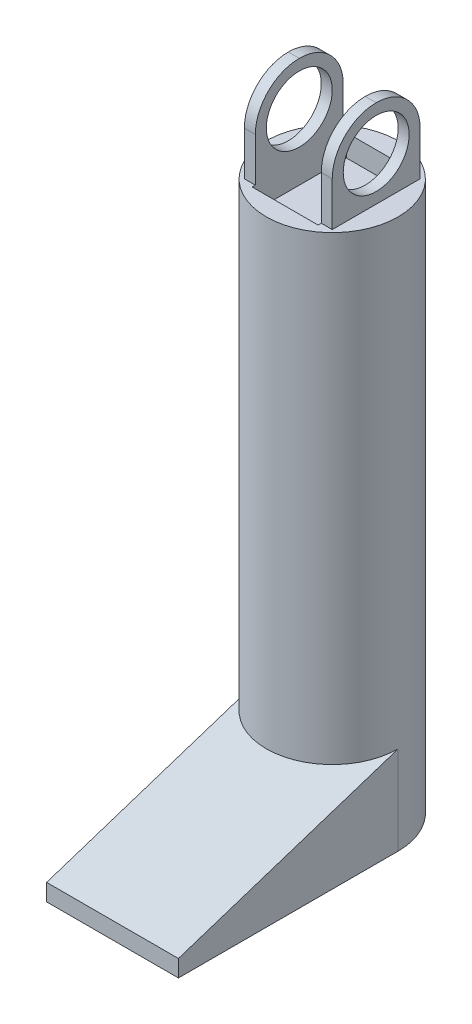
ISO-10303-21;
HEADER;
FILE_DESCRIPTION(('STEP AP214'),'2;1');
FILE_NAME('part.step','',(''),(''),'','','');
FILE_SCHEMA(('AUTOMOTIVE_DESIGN { 1 0 10303 214 1 1 1 1 }'));
ENDSEC;
DATA;
#1=APPLICATION_CONTEXT('core data for automotive mechanical design processes');
#2=APPLICATION_PROTOCOL_DEFINITION('international standard','automotive_design',2000,#1);
#3=PRODUCT_CONTEXT('',#1,'mechanical');
#4=PRODUCT('Part','Part','',(#3));
#5=PRODUCT_RELATED_PRODUCT_CATEGORY('part','',(#4));
#6=PRODUCT_DEFINITION_FORMATION('','',#4);
#7=PRODUCT_DEFINITION_CONTEXT('part definition',#1,'design');
#8=PRODUCT_DEFINITION('design','',#6,#7);
#9=PRODUCT_DEFINITION_SHAPE('','',#8);
#10=(LENGTH_UNIT() NAMED_UNIT(*) SI_UNIT(.MILLI.,.METRE.));
#11=(NAMED_UNIT(*) PLANE_ANGLE_UNIT() SI_UNIT($,.RADIAN.));
#12=(NAMED_UNIT(*) SI_UNIT($,.STERADIAN.) SOLID_ANGLE_UNIT());
#13=UNCERTAINTY_MEASURE_WITH_UNIT(LENGTH_MEASURE(1.E-05),#10,'distance_accuracy_value','');
#14=(GEOMETRIC_REPRESENTATION_CONTEXT(3) GLOBAL_UNCERTAINTY_ASSIGNED_CONTEXT((#13)) GLOBAL_UNIT_ASSIGNED_CONTEXT((#10,
#11,#12)) REPRESENTATION_CONTEXT('',''));
#15=CARTESIAN_POINT('',(0.,0.,0.));
#16=DIRECTION('',(0.,0.,1.));
#17=DIRECTION('',(1.,0.,0.));
#18=AXIS2_PLACEMENT_3D('',#15,#16,#17);
#19=CARTESIAN_POINT('',(-3.,4.03289864058456,10.));
#20=DIRECTION('',(1.,0.,0.));
#21=DIRECTION('',(0.,0.,-1.));
#22=AXIS2_PLACEMENT_3D('',#19,#20,#21);
#23=PLANE('',#22);
#24=DIRECTION('',(0.,0.310266308273967,-0.950649682033315));
#25=VECTOR('',#24,1.);
#26=CARTESIAN_POINT('',(-3.,3.64467091875967,1.18952187352377));
#27=LINE('',#26,#25);
#28=CARTESIAN_POINT('',(-3.,0.76916948632505,10.));
#29=VERTEX_POINT('',#28);
#30=CARTESIAN_POINT('',(-3.,4.03289864058456,0.));
#31=VERTEX_POINT('',#30);
#32=EDGE_CURVE('E51',#29,#31,#27,.T.);
#33=ORIENTED_EDGE('',*,*,#32,.T.);
#34=DIRECTION('',(0.,-1.,0.));
#35=VECTOR('',#34,1.);
#36=CARTESIAN_POINT('',(-3.,4.03289864058456,0.));
#37=LINE('',#36,#35);
#38=CARTESIAN_POINT('',(-3.,0.,0.));
#39=VERTEX_POINT('',#38);
#40=EDGE_CURVE('E177',#31,#39,#37,.T.);
#41=ORIENTED_EDGE('',*,*,#40,.T.);
#42=DIRECTION('',(0.,0.,-1.));
#43=VECTOR('',#42,1.);
#44=CARTESIAN_POINT('',(-3.,0.,10.));
#45=LINE('',#44,#43);
#46=CARTESIAN_POINT('',(-3.,0.,10.));
#47=VERTEX_POINT('',#46);
#48=EDGE_CURVE('E194',#47,#39,#45,.T.);
#49=ORIENTED_EDGE('',*,*,#48,.F.);
#50=DIRECTION('',(0.,-1.,0.));
#51=VECTOR('',#50,1.);
#52=CARTESIAN_POINT('',(-3.,4.03289864058456,10.));
#53=LINE('',#52,#51);
#54=EDGE_CURVE('E179',#29,#47,#53,.T.);
#55=ORIENTED_EDGE('',*,*,#54,.F.);
#56=EDGE_LOOP('',(#33,#41,#49,#55));
#57=FACE_BOUND('',#56,.T.);
#58=ADVANCED_FACE('F37',(#57),#23,.F.);
#59=CARTESIAN_POINT('',(3.,4.03289864058456,10.));
#60=DIRECTION('',(-1.,0.,0.));
#61=DIRECTION('',(0.,0.,1.));
#62=AXIS2_PLACEMENT_3D('',#59,#60,#61);
#63=PLANE('',#62);
#64=DIRECTION('',(0.,0.310266308273967,-0.950649682033316));
#65=VECTOR('',#64,1.);
#66=CARTESIAN_POINT('',(3.,1.08335296752159,9.03734817950044));
#67=LINE('',#66,#65);
#68=CARTESIAN_POINT('',(3.,0.76916948632505,10.));
#69=VERTEX_POINT('',#68);
#70=CARTESIAN_POINT('',(3.,4.03289864058456,0.));
#71=VERTEX_POINT('',#70);
#72=EDGE_CURVE('E171',#69,#71,#67,.T.);
#73=ORIENTED_EDGE('',*,*,#72,.F.);
#74=DIRECTION('',(0.,1.,0.));
#75=VECTOR('',#74,1.);
#76=CARTESIAN_POINT('',(3.,4.03289864058456,10.));
#77=LINE('',#76,#75);
#78=CARTESIAN_POINT('',(3.,0.,10.));
#79=VERTEX_POINT('',#78);
#80=EDGE_CURVE('E189',#79,#69,#77,.T.);
#81=ORIENTED_EDGE('',*,*,#80,.F.);
#82=DIRECTION('',(0.,0.,-1.));
#83=VECTOR('',#82,1.);
#84=CARTESIAN_POINT('',(3.,0.,10.));
#85=LINE('',#84,#83);
#86=CARTESIAN_POINT('',(3.,0.,0.));
#87=VERTEX_POINT('',#86);
#88=EDGE_CURVE('E192',#79,#87,#85,.T.);
#89=ORIENTED_EDGE('',*,*,#88,.T.);
#90=DIRECTION('',(0.,1.,0.));
#91=VECTOR('',#90,1.);
#92=CARTESIAN_POINT('',(3.,4.03289864058456,0.));
#93=LINE('',#92,#91);
#94=EDGE_CURVE('E184',#87,#71,#93,.T.);
#95=ORIENTED_EDGE('',*,*,#94,.T.);
#96=EDGE_LOOP('',(#73,#81,#89,#95));
#97=FACE_BOUND('',#96,.T.);
#98=ADVANCED_FACE('F364',(#97),#63,.F.);
#99=CARTESIAN_POINT('',(0.,0.,10.));
#100=DIRECTION('',(0.,0.,-1.));
#101=DIRECTION('',(-1.,0.,0.));
#102=AXIS2_PLACEMENT_3D('',#99,#100,#101);
#103=PLANE('',#102);
#104=DIRECTION('',(1.,0.,0.));
#105=VECTOR('',#104,1.);
#106=CARTESIAN_POINT('',(0.,0.769169486325047,10.));
#107=LINE('',#106,#105);
#108=EDGE_CURVE('E11',#29,#69,#107,.T.);
#109=ORIENTED_EDGE('',*,*,#108,.F.);
#110=ORIENTED_EDGE('',*,*,#54,.T.);
#111=DIRECTION('',(1.,0.,0.));
#112=VECTOR('',#111,1.);
#113=CARTESIAN_POINT('',(3.,0.,10.));
#114=LINE('',#113,#112);
#115=EDGE_CURVE('E634',#47,#79,#114,.T.);
#116=ORIENTED_EDGE('',*,*,#115,.T.);
#117=ORIENTED_EDGE('',*,*,#80,.T.);
#118=EDGE_LOOP('',(#109,#110,#116,#117));
#119=FACE_BOUND('',#118,.T.);
#120=ADVANCED_FACE('F355',(#119),#103,.F.);
#121=CARTESIAN_POINT('',(2.,29.,2.));
#122=DIRECTION('',(0.,0.,-1.));
#123=DIRECTION('',(-1.,0.,0.));
#124=AXIS2_PLACEMENT_3D('',#121,#122,#123);
#125=PLANE('',#124);
#126=DIRECTION('',(0.,1.,0.));
#127=VECTOR('',#126,1.);
#128=CARTESIAN_POINT('',(-1.5,29.,2.));
#129=LINE('',#128,#127);
#130=CARTESIAN_POINT('',(-1.5,25.,2.));
#131=VERTEX_POINT('',#130);
#132=CARTESIAN_POINT('',(-1.5,27.,2.));
#133=VERTEX_POINT('',#132);
#134=EDGE_CURVE('E245',#131,#133,#129,.T.);
#135=ORIENTED_EDGE('',*,*,#134,.T.);
#136=DIRECTION('',(1.,0.,0.));
#137=VECTOR('',#136,1.);
#138=CARTESIAN_POINT('',(2.,27.,2.));
#139=LINE('',#138,#137);
#140=CARTESIAN_POINT('',(-2.,27.,2.));
#141=VERTEX_POINT('',#140);
#142=EDGE_CURVE('E168',#133,#141,#139,.F.);
#143=ORIENTED_EDGE('',*,*,#142,.T.);
#144=DIRECTION('',(0.,-1.,0.));
#145=VECTOR('',#144,1.);
#146=CARTESIAN_POINT('',(-2.,29.,2.));
#147=LINE('',#146,#145);
#148=CARTESIAN_POINT('',(-2.,25.,2.));
#149=VERTEX_POINT('',#148);
#150=EDGE_CURVE('E268',#141,#149,#147,.T.);
#151=ORIENTED_EDGE('',*,*,#150,.T.);
#152=DIRECTION('',(1.,0.,0.));
#153=VECTOR('',#152,1.);
#154=CARTESIAN_POINT('',(2.,25.,2.));
#155=LINE('',#154,#153);
#156=EDGE_CURVE('E252',#149,#131,#155,.T.);
#157=ORIENTED_EDGE('',*,*,#156,.T.);
#158=EDGE_LOOP('',(#135,#143,#151,#157));
#159=FACE_BOUND('',#158,.T.);
#160=ADVANCED_FACE('F317',(#159),#125,.F.);
#161=CARTESIAN_POINT('',(2.,29.,-2.));
#162=DIRECTION('',(0.,0.,1.));
#163=DIRECTION('',(1.,0.,0.));
#164=AXIS2_PLACEMENT_3D('',#161,#162,#163);
#165=PLANE('',#164);
#166=DIRECTION('',(0.,-1.,0.));
#167=VECTOR('',#166,1.);
#168=CARTESIAN_POINT('',(-2.,29.,-2.));
#169=LINE('',#168,#167);
#170=CARTESIAN_POINT('',(-2.,27.,-2.));
#171=VERTEX_POINT('',#170);
#172=CARTESIAN_POINT('',(-2.,25.,-2.));
#173=VERTEX_POINT('',#172);
#174=EDGE_CURVE('E262',#171,#173,#169,.T.);
#175=ORIENTED_EDGE('',*,*,#174,.F.);
#176=DIRECTION('',(-1.,0.,0.));
#177=VECTOR('',#176,1.);
#178=CARTESIAN_POINT('',(2.,27.,-2.));
#179=LINE('',#178,#177);
#180=CARTESIAN_POINT('',(-1.5,27.,-2.));
#181=VERTEX_POINT('',#180);
#182=EDGE_CURVE('E297',#171,#181,#179,.F.);
#183=ORIENTED_EDGE('',*,*,#182,.T.);
#184=DIRECTION('',(0.,-1.,0.));
#185=VECTOR('',#184,1.);
#186=CARTESIAN_POINT('',(-1.5,29.,-2.));
#187=LINE('',#186,#185);
#188=CARTESIAN_POINT('',(-1.5,25.,-2.));
#189=VERTEX_POINT('',#188);
#190=EDGE_CURVE('E240',#181,#189,#187,.T.);
#191=ORIENTED_EDGE('',*,*,#190,.T.);
#192=DIRECTION('',(-1.,0.,0.));
#193=VECTOR('',#192,1.);
#194=CARTESIAN_POINT('',(2.,25.,-2.));
#195=LINE('',#194,#193);
#196=EDGE_CURVE('E258',#189,#173,#195,.T.);
#197=ORIENTED_EDGE('',*,*,#196,.T.);
#198=EDGE_LOOP('',(#175,#183,#191,#197));
#199=FACE_BOUND('',#198,.T.);
#200=ADVANCED_FACE('F346',(#199),#165,.F.);
#201=CARTESIAN_POINT('',(0.,25.,0.));
#202=DIRECTION('',(0.,1.,0.));
#203=DIRECTION('',(0.,0.,1.));
#204=AXIS2_PLACEMENT_3D('',#201,#202,#203);
#205=PLANE('',#204);
#206=DIRECTION('',(0.,0.,1.));
#207=VECTOR('',#206,1.);
#208=CARTESIAN_POINT('',(-1.5,25.,0.));
#209=LINE('',#208,#207);
#210=CARTESIAN_POINT('',(-1.5,25.,-2.14410673269618));
#211=VERTEX_POINT('',#210);
#212=EDGE_CURVE('E242',#211,#189,#209,.T.);
#213=ORIENTED_EDGE('',*,*,#212,.F.);
#214=DIRECTION('',(-1.,0.,0.));
#215=VECTOR('',#214,1.);
#216=CARTESIAN_POINT('',(0.,25.,-2.14410673269618));
#217=LINE('',#216,#215);
#218=CARTESIAN_POINT('',(1.5,25.,-2.14410673269618));
#219=VERTEX_POINT('',#218);
#220=EDGE_CURVE('E276',#219,#211,#217,.T.);
#221=ORIENTED_EDGE('',*,*,#220,.F.);
#222=DIRECTION('',(0.,0.,-1.));
#223=VECTOR('',#222,1.);
#224=CARTESIAN_POINT('',(1.5,25.,0.));
#225=LINE('',#224,#223);
#226=CARTESIAN_POINT('',(1.5,25.,-2.));
#227=VERTEX_POINT('',#226);
#228=EDGE_CURVE('E235',#227,#219,#225,.T.);
#229=ORIENTED_EDGE('',*,*,#228,.F.);
#230=CARTESIAN_POINT('',(2.,25.,-2.));
#231=VERTEX_POINT('',#230);
#232=EDGE_CURVE('E259',#231,#227,#195,.T.);
#233=ORIENTED_EDGE('',*,*,#232,.F.);
#234=DIRECTION('',(0.,0.,-1.));
#235=VECTOR('',#234,1.);
#236=CARTESIAN_POINT('',(2.,25.,-2.));
#237=LINE('',#236,#235);
#238=CARTESIAN_POINT('',(2.,25.,2.));
#239=VERTEX_POINT('',#238);
#240=EDGE_CURVE('E255',#239,#231,#237,.T.);
#241=ORIENTED_EDGE('',*,*,#240,.F.);
#242=CARTESIAN_POINT('',(1.5,25.,2.));
#243=VERTEX_POINT('',#242);
#244=EDGE_CURVE('E251',#243,#239,#155,.T.);
#245=ORIENTED_EDGE('',*,*,#244,.F.);
#246=CARTESIAN_POINT('',(1.5,25.,2.14410673269618));
#247=VERTEX_POINT('',#246);
#248=EDGE_CURVE('E238',#247,#243,#225,.T.);
#249=ORIENTED_EDGE('',*,*,#248,.F.);
#250=DIRECTION('',(1.,0.,0.));
#251=VECTOR('',#250,1.);
#252=CARTESIAN_POINT('',(0.,25.,2.14410673269618));
#253=LINE('',#252,#251);
#254=CARTESIAN_POINT('',(-1.5,25.,2.14410673269618));
#255=VERTEX_POINT('',#254);
#256=EDGE_CURVE('E273',#255,#247,#253,.T.);
#257=ORIENTED_EDGE('',*,*,#256,.F.);
#258=EDGE_CURVE('E246',#131,#255,#209,.T.);
#259=ORIENTED_EDGE('',*,*,#258,.F.);
#260=ORIENTED_EDGE('',*,*,#156,.F.);
#261=DIRECTION('',(0.,0.,1.));
#262=VECTOR('',#261,1.);
#263=CARTESIAN_POINT('',(-2.,25.,-2.));
#264=LINE('',#263,#262);
#265=EDGE_CURVE('E248',#173,#149,#264,.T.);
#266=ORIENTED_EDGE('',*,*,#265,.F.);
#267=ORIENTED_EDGE('',*,*,#196,.F.);
#268=EDGE_LOOP('',(#213,#221,#229,#233,#241,#245,#249,#257,#259,#260,#266,#267));
#269=FACE_BOUND('',#268,.T.);
#270=CARTESIAN_POINT('',(0.,25.,0.));
#271=DIRECTION('',(0.,1.,0.));
#272=DIRECTION('',(0.,0.,1.));
#273=AXIS2_PLACEMENT_3D('',#270,#271,#272);
#274=CIRCLE('',#273,3.);
#275=CARTESIAN_POINT('',(0.,25.,3.));
#276=VERTEX_POINT('',#275);
#277=EDGE_CURVE('E270',#276,#276,#274,.T.);
#278=ORIENTED_EDGE('',*,*,#277,.T.);
#279=EDGE_LOOP('',(#278));
#280=FACE_BOUND('',#279,.T.);
#281=ADVANCED_FACE('F328',(#269,#280),#205,.T.);
#282=CARTESIAN_POINT('',(0.,25.,0.));
#283=DIRECTION('',(0.,-1.,0.));
#284=DIRECTION('',(0.,0.,-1.));
#285=AXIS2_PLACEMENT_3D('',#282,#283,#284);
#286=CYLINDRICAL_SURFACE('',#285,3.);
#287=ORIENTED_EDGE('',*,*,#277,.F.);
#288=EDGE_LOOP('',(#287));
#289=FACE_BOUND('',#288,.T.);
#290=CARTESIAN_POINT('',(0.,4.03289864058456,0.));
#291=DIRECTION('',(0.,-1.,0.));
#292=DIRECTION('',(0.,0.,-1.));
#293=AXIS2_PLACEMENT_3D('',#290,#291,#292);
#294=CIRCLE('',#293,3.);
#295=EDGE_CURVE('E45',#71,#31,#294,.T.);
#296=ORIENTED_EDGE('',*,*,#295,.F.);
#297=ORIENTED_EDGE('',*,*,#94,.F.);
#298=CARTESIAN_POINT('',(0.,0.,0.));
#299=DIRECTION('',(0.,1.,0.));
#300=DIRECTION('',(0.,0.,1.));
#301=AXIS2_PLACEMENT_3D('',#298,#299,#300);
#302=CIRCLE('',#301,3.);
#303=EDGE_CURVE('E183',#87,#39,#302,.T.);
#304=ORIENTED_EDGE('',*,*,#303,.T.);
#305=ORIENTED_EDGE('',*,*,#40,.F.);
#306=EDGE_LOOP('',(#296,#297,#304,#305));
#307=FACE_BOUND('',#306,.T.);
#308=ADVANCED_FACE('F181',(#289,#307),#286,.T.);
#309=CARTESIAN_POINT('',(0.,0.,0.));
#310=DIRECTION('',(0.,1.,0.));
#311=DIRECTION('',(0.,0.,1.));
#312=AXIS2_PLACEMENT_3D('',#309,#310,#311);
#313=PLANE('',#312);
#314=ORIENTED_EDGE('',*,*,#303,.F.);
#315=ORIENTED_EDGE('',*,*,#88,.F.);
#316=ORIENTED_EDGE('',*,*,#115,.F.);
#317=ORIENTED_EDGE('',*,*,#48,.T.);
#318=EDGE_LOOP('',(#314,#315,#316,#317));
#319=FACE_BOUND('',#318,.T.);
#320=ADVANCED_FACE('F400',(#319),#313,.F.);
#321=CARTESIAN_POINT('',(-2.,29.,-2.));
#322=DIRECTION('',(1.,0.,0.));
#323=DIRECTION('',(0.,0.,-1.));
#324=AXIS2_PLACEMENT_3D('',#321,#322,#323);
#325=PLANE('',#324);
#326=CARTESIAN_POINT('',(-2.,27.,0.));
#327=DIRECTION('',(-1.,0.,0.));
#328=DIRECTION('',(0.,0.,1.));
#329=AXIS2_PLACEMENT_3D('',#326,#327,#328);
#330=CIRCLE('',#329,1.5);
#331=CARTESIAN_POINT('',(-2.,27.,1.5));
#332=VERTEX_POINT('',#331);
#333=EDGE_CURVE('E197',#332,#332,#330,.T.);
#334=ORIENTED_EDGE('',*,*,#333,.F.);
#335=EDGE_LOOP('',(#334));
#336=FACE_BOUND('',#335,.T.);
#337=CARTESIAN_POINT('',(-2.,27.,0.));
#338=DIRECTION('',(1.,0.,0.));
#339=DIRECTION('',(0.,0.,-1.));
#340=AXIS2_PLACEMENT_3D('',#337,#338,#339);
#341=CIRCLE('',#340,2.);
#342=CARTESIAN_POINT('',(-2.,29.,0.));
#343=VERTEX_POINT('',#342);
#344=EDGE_CURVE('E293',#141,#343,#341,.F.);
#345=ORIENTED_EDGE('',*,*,#344,.T.);
#346=CARTESIAN_POINT('',(-2.,27.,0.));
#347=DIRECTION('',(1.,0.,0.));
#348=DIRECTION('',(0.,0.,-1.));
#349=AXIS2_PLACEMENT_3D('',#346,#347,#348);
#350=CIRCLE('',#349,2.);
#351=EDGE_CURVE('E295',#343,#171,#350,.F.);
#352=ORIENTED_EDGE('',*,*,#351,.T.);
#353=ORIENTED_EDGE('',*,*,#174,.T.);
#354=ORIENTED_EDGE('',*,*,#265,.T.);
#355=ORIENTED_EDGE('',*,*,#150,.F.);
#356=EDGE_LOOP('',(#345,#352,#353,#354,#355));
#357=FACE_BOUND('',#356,.T.);
#358=ADVANCED_FACE('F319',(#336,#357),#325,.F.);
#359=DIRECTION('',(0.,-1.,0.));
#360=VECTOR('',#359,1.);
#361=CARTESIAN_POINT('',(2.,29.,2.));
#362=LINE('',#361,#360);
#363=CARTESIAN_POINT('',(2.,27.,2.));
#364=VERTEX_POINT('',#363);
#365=EDGE_CURVE('E266',#364,#239,#362,.T.);
#366=ORIENTED_EDGE('',*,*,#365,.F.);
#367=DIRECTION('',(1.,0.,0.));
#368=VECTOR('',#367,1.);
#369=CARTESIAN_POINT('',(2.,27.,2.));
#370=LINE('',#369,#368);
#371=CARTESIAN_POINT('',(1.5,27.,2.));
#372=VERTEX_POINT('',#371);
#373=EDGE_CURVE('E284',#364,#372,#370,.F.);
#374=ORIENTED_EDGE('',*,*,#373,.T.);
#375=DIRECTION('',(0.,-1.,0.));
#376=VECTOR('',#375,1.);
#377=CARTESIAN_POINT('',(1.5,29.,2.));
#378=LINE('',#377,#376);
#379=EDGE_CURVE('E237',#372,#243,#378,.T.);
#380=ORIENTED_EDGE('',*,*,#379,.T.);
#381=ORIENTED_EDGE('',*,*,#244,.T.);
#382=EDGE_LOOP('',(#366,#374,#380,#381));
#383=FACE_BOUND('',#382,.T.);
#384=ADVANCED_FACE('F357',(#383),#125,.F.);
#385=CARTESIAN_POINT('',(2.,29.,-2.));
#386=DIRECTION('',(-1.,0.,0.));
#387=DIRECTION('',(0.,0.,1.));
#388=AXIS2_PLACEMENT_3D('',#385,#386,#387);
#389=PLANE('',#388);
#390=CARTESIAN_POINT('',(2.,27.,0.));
#391=DIRECTION('',(-1.,0.,0.));
#392=DIRECTION('',(0.,0.,1.));
#393=AXIS2_PLACEMENT_3D('',#390,#391,#392);
#394=CIRCLE('',#393,1.5);
#395=CARTESIAN_POINT('',(2.,27.,1.5));
#396=VERTEX_POINT('',#395);
#397=EDGE_CURVE('E205',#396,#396,#394,.T.);
#398=ORIENTED_EDGE('',*,*,#397,.T.);
#399=EDGE_LOOP('',(#398));
#400=FACE_BOUND('',#399,.T.);
#401=CARTESIAN_POINT('',(2.,27.,0.));
#402=DIRECTION('',(-1.,0.,0.));
#403=DIRECTION('',(0.,0.,1.));
#404=AXIS2_PLACEMENT_3D('',#401,#402,#403);
#405=CIRCLE('',#404,2.);
#406=CARTESIAN_POINT('',(2.,27.,-2.));
#407=VERTEX_POINT('',#406);
#408=CARTESIAN_POINT('',(2.,29.,0.));
#409=VERTEX_POINT('',#408);
#410=EDGE_CURVE('E278',#407,#409,#405,.F.);
#411=ORIENTED_EDGE('',*,*,#410,.T.);
#412=CARTESIAN_POINT('',(2.,27.,0.));
#413=DIRECTION('',(-1.,0.,0.));
#414=DIRECTION('',(0.,0.,1.));
#415=AXIS2_PLACEMENT_3D('',#412,#413,#414);
#416=CIRCLE('',#415,2.);
#417=EDGE_CURVE('E282',#409,#364,#416,.F.);
#418=ORIENTED_EDGE('',*,*,#417,.T.);
#419=ORIENTED_EDGE('',*,*,#365,.T.);
#420=ORIENTED_EDGE('',*,*,#240,.T.);
#421=DIRECTION('',(0.,-1.,0.));
#422=VECTOR('',#421,1.);
#423=CARTESIAN_POINT('',(2.,29.,-2.));
#424=LINE('',#423,#422);
#425=EDGE_CURVE('E264',#407,#231,#424,.T.);
#426=ORIENTED_EDGE('',*,*,#425,.F.);
#427=EDGE_LOOP('',(#411,#418,#419,#420,#426));
#428=FACE_BOUND('',#427,.T.);
#429=ADVANCED_FACE('F361',(#400,#428),#389,.F.);
#430=DIRECTION('',(0.,1.,0.));
#431=VECTOR('',#430,1.);
#432=CARTESIAN_POINT('',(1.5,29.,-2.));
#433=LINE('',#432,#431);
#434=CARTESIAN_POINT('',(1.5,27.,-2.));
#435=VERTEX_POINT('',#434);
#436=EDGE_CURVE('E224',#227,#435,#433,.T.);
#437=ORIENTED_EDGE('',*,*,#436,.T.);
#438=DIRECTION('',(-1.,0.,0.));
#439=VECTOR('',#438,1.);
#440=CARTESIAN_POINT('',(2.,27.,-2.));
#441=LINE('',#440,#439);
#442=EDGE_CURVE('E291',#435,#407,#441,.F.);
#443=ORIENTED_EDGE('',*,*,#442,.T.);
#444=ORIENTED_EDGE('',*,*,#425,.T.);
#445=ORIENTED_EDGE('',*,*,#232,.T.);
#446=EDGE_LOOP('',(#437,#443,#444,#445));
#447=FACE_BOUND('',#446,.T.);
#448=ADVANCED_FACE('F349',(#447),#165,.F.);
#449=CARTESIAN_POINT('',(-1.5,29.,-1.5));
#450=DIRECTION('',(1.,0.,0.));
#451=DIRECTION('',(0.,0.,-1.));
#452=AXIS2_PLACEMENT_3D('',#449,#450,#451);
#453=PLANE('',#452);
#454=CARTESIAN_POINT('',(-1.5,27.,0.));
#455=DIRECTION('',(1.,0.,0.));
#456=DIRECTION('',(0.,0.,-1.));
#457=AXIS2_PLACEMENT_3D('',#454,#455,#456);
#458=CIRCLE('',#457,1.5);
#459=CARTESIAN_POINT('',(-1.5,27.,-1.5));
#460=VERTEX_POINT('',#459);
#461=EDGE_CURVE('E202',#460,#460,#458,.T.);
#462=ORIENTED_EDGE('',*,*,#461,.F.);
#463=EDGE_LOOP('',(#462));
#464=FACE_BOUND('',#463,.T.);
#465=ORIENTED_EDGE('',*,*,#190,.F.);
#466=CARTESIAN_POINT('',(-1.5,27.,0.));
#467=DIRECTION('',(1.,0.,0.));
#468=DIRECTION('',(0.,0.,-1.));
#469=AXIS2_PLACEMENT_3D('',#466,#467,#468);
#470=CIRCLE('',#469,2.);
#471=CARTESIAN_POINT('',(-1.5,29.,0.));
#472=VERTEX_POINT('',#471);
#473=EDGE_CURVE('E301',#181,#472,#470,.T.);
#474=ORIENTED_EDGE('',*,*,#473,.T.);
#475=CARTESIAN_POINT('',(-1.5,27.,0.));
#476=DIRECTION('',(1.,0.,0.));
#477=DIRECTION('',(0.,0.,-1.));
#478=AXIS2_PLACEMENT_3D('',#475,#476,#477);
#479=CIRCLE('',#478,2.);
#480=EDGE_CURVE('E59',#472,#133,#479,.T.);
#481=ORIENTED_EDGE('',*,*,#480,.T.);
#482=ORIENTED_EDGE('',*,*,#134,.F.);
#483=ORIENTED_EDGE('',*,*,#258,.T.);
#484=DIRECTION('',(0.,1.,0.));
#485=VECTOR('',#484,1.);
#486=CARTESIAN_POINT('',(-1.5,24.,2.14410673269618));
#487=LINE('',#486,#485);
#488=CARTESIAN_POINT('',(-1.5,24.,2.14410673269618));
#489=VERTEX_POINT('',#488);
#490=EDGE_CURVE('E220',#489,#255,#487,.T.);
#491=ORIENTED_EDGE('',*,*,#490,.F.);
#492=DIRECTION('',(0.,0.,1.));
#493=VECTOR('',#492,1.);
#494=CARTESIAN_POINT('',(-1.5,24.,-2.14410673269618));
#495=LINE('',#494,#493);
#496=CARTESIAN_POINT('',(-1.5,24.,-2.14410673269618));
#497=VERTEX_POINT('',#496);
#498=EDGE_CURVE('E208',#497,#489,#495,.T.);
#499=ORIENTED_EDGE('',*,*,#498,.F.);
#500=DIRECTION('',(0.,1.,0.));
#501=VECTOR('',#500,1.);
#502=CARTESIAN_POINT('',(-1.5,24.,-2.14410673269618));
#503=LINE('',#502,#501);
#504=EDGE_CURVE('E221',#497,#211,#503,.T.);
#505=ORIENTED_EDGE('',*,*,#504,.T.);
#506=ORIENTED_EDGE('',*,*,#212,.T.);
#507=EDGE_LOOP('',(#465,#474,#481,#482,#483,#491,#499,#505,#506));
#508=FACE_BOUND('',#507,.T.);
#509=ADVANCED_FACE('F333',(#464,#508),#453,.T.);
#510=CARTESIAN_POINT('',(1.5,29.,-1.5));
#511=DIRECTION('',(-1.,0.,0.));
#512=DIRECTION('',(0.,0.,1.));
#513=AXIS2_PLACEMENT_3D('',#510,#511,#512);
#514=PLANE('',#513);
#515=CARTESIAN_POINT('',(1.5,27.,0.));
#516=DIRECTION('',(-1.,0.,0.));
#517=DIRECTION('',(0.,0.,1.));
#518=AXIS2_PLACEMENT_3D('',#515,#516,#517);
#519=CIRCLE('',#518,1.5);
#520=CARTESIAN_POINT('',(1.5,27.,1.5));
#521=VERTEX_POINT('',#520);
#522=EDGE_CURVE('E200',#521,#521,#519,.T.);
#523=ORIENTED_EDGE('',*,*,#522,.F.);
#524=EDGE_LOOP('',(#523));
#525=FACE_BOUND('',#524,.T.);
#526=ORIENTED_EDGE('',*,*,#379,.F.);
#527=CARTESIAN_POINT('',(1.5,27.,0.));
#528=DIRECTION('',(-1.,0.,0.));
#529=DIRECTION('',(0.,0.,1.));
#530=AXIS2_PLACEMENT_3D('',#527,#528,#529);
#531=CIRCLE('',#530,2.);
#532=CARTESIAN_POINT('',(1.5,29.,0.));
#533=VERTEX_POINT('',#532);
#534=EDGE_CURVE('E289',#372,#533,#531,.T.);
#535=ORIENTED_EDGE('',*,*,#534,.T.);
#536=CARTESIAN_POINT('',(1.5,27.,0.));
#537=DIRECTION('',(-1.,0.,0.));
#538=DIRECTION('',(0.,0.,1.));
#539=AXIS2_PLACEMENT_3D('',#536,#537,#538);
#540=CIRCLE('',#539,2.);
#541=EDGE_CURVE('E287',#533,#435,#540,.T.);
#542=ORIENTED_EDGE('',*,*,#541,.T.);
#543=ORIENTED_EDGE('',*,*,#436,.F.);
#544=ORIENTED_EDGE('',*,*,#228,.T.);
#545=DIRECTION('',(0.,1.,0.));
#546=VECTOR('',#545,1.);
#547=CARTESIAN_POINT('',(1.5,24.,-2.14410673269618));
#548=LINE('',#547,#546);
#549=CARTESIAN_POINT('',(1.5,24.,-2.14410673269618));
#550=VERTEX_POINT('',#549);
#551=EDGE_CURVE('E225',#550,#219,#548,.T.);
#552=ORIENTED_EDGE('',*,*,#551,.F.);
#553=DIRECTION('',(0.,0.,-1.));
#554=VECTOR('',#553,1.);
#555=CARTESIAN_POINT('',(1.5,24.,-2.14410673269618));
#556=LINE('',#555,#554);
#557=CARTESIAN_POINT('',(1.5,24.,2.14410673269618));
#558=VERTEX_POINT('',#557);
#559=EDGE_CURVE('E214',#558,#550,#556,.T.);
#560=ORIENTED_EDGE('',*,*,#559,.F.);
#561=DIRECTION('',(0.,1.,0.));
#562=VECTOR('',#561,1.);
#563=CARTESIAN_POINT('',(1.5,24.,2.14410673269618));
#564=LINE('',#563,#562);
#565=EDGE_CURVE('E228',#558,#247,#564,.T.);
#566=ORIENTED_EDGE('',*,*,#565,.T.);
#567=ORIENTED_EDGE('',*,*,#248,.T.);
#568=EDGE_LOOP('',(#526,#535,#542,#543,#544,#552,#560,#566,#567));
#569=FACE_BOUND('',#568,.T.);
#570=ADVANCED_FACE('F383',(#525,#569),#514,.T.);
#571=CARTESIAN_POINT('',(1.5,24.,-2.14410673269618));
#572=DIRECTION('',(0.,0.,-1.));
#573=DIRECTION('',(-1.,0.,0.));
#574=AXIS2_PLACEMENT_3D('',#571,#572,#573);
#575=PLANE('',#574);
#576=ORIENTED_EDGE('',*,*,#220,.T.);
#577=ORIENTED_EDGE('',*,*,#504,.F.);
#578=DIRECTION('',(-1.,0.,0.));
#579=VECTOR('',#578,1.);
#580=CARTESIAN_POINT('',(1.5,24.,-2.14410673269618));
#581=LINE('',#580,#579);
#582=EDGE_CURVE('E217',#550,#497,#581,.T.);
#583=ORIENTED_EDGE('',*,*,#582,.F.);
#584=ORIENTED_EDGE('',*,*,#551,.T.);
#585=EDGE_LOOP('',(#576,#577,#583,#584));
#586=FACE_BOUND('',#585,.T.);
#587=ADVANCED_FACE('F380',(#586),#575,.F.);
#588=CARTESIAN_POINT('',(1.5,24.,2.14410673269618));
#589=DIRECTION('',(0.,0.,1.));
#590=DIRECTION('',(1.,0.,0.));
#591=AXIS2_PLACEMENT_3D('',#588,#589,#590);
#592=PLANE('',#591);
#593=ORIENTED_EDGE('',*,*,#256,.T.);
#594=ORIENTED_EDGE('',*,*,#565,.F.);
#595=DIRECTION('',(1.,0.,0.));
#596=VECTOR('',#595,1.);
#597=CARTESIAN_POINT('',(1.5,24.,2.14410673269618));
#598=LINE('',#597,#596);
#599=EDGE_CURVE('E211',#489,#558,#598,.T.);
#600=ORIENTED_EDGE('',*,*,#599,.F.);
#601=ORIENTED_EDGE('',*,*,#490,.T.);
#602=EDGE_LOOP('',(#593,#594,#600,#601));
#603=FACE_BOUND('',#602,.T.);
#604=ADVANCED_FACE('F337',(#603),#592,.F.);
#605=CARTESIAN_POINT('',(0.,24.,0.));
#606=DIRECTION('',(0.,-1.,0.));
#607=DIRECTION('',(0.,0.,-1.));
#608=AXIS2_PLACEMENT_3D('',#605,#606,#607);
#609=PLANE('',#608);
#610=ORIENTED_EDGE('',*,*,#498,.T.);
#611=ORIENTED_EDGE('',*,*,#599,.T.);
#612=ORIENTED_EDGE('',*,*,#559,.T.);
#613=ORIENTED_EDGE('',*,*,#582,.T.);
#614=EDGE_LOOP('',(#610,#611,#612,#613));
#615=FACE_BOUND('',#614,.T.);
#616=ADVANCED_FACE('F340',(#615),#609,.F.);
#617=CARTESIAN_POINT('',(3.,27.,0.));
#618=DIRECTION('',(-1.,0.,0.));
#619=DIRECTION('',(0.,0.,1.));
#620=AXIS2_PLACEMENT_3D('',#617,#618,#619);
#621=CYLINDRICAL_SURFACE('',#620,1.5);
#622=ORIENTED_EDGE('',*,*,#522,.T.);
#623=EDGE_LOOP('',(#622));
#624=FACE_BOUND('',#623,.T.);
#625=ORIENTED_EDGE('',*,*,#397,.F.);
#626=EDGE_LOOP('',(#625));
#627=FACE_BOUND('',#626,.T.);
#628=ADVANCED_FACE('F373',(#624,#627),#621,.F.);
#629=ORIENTED_EDGE('',*,*,#461,.T.);
#630=EDGE_LOOP('',(#629));
#631=FACE_BOUND('',#630,.T.);
#632=ORIENTED_EDGE('',*,*,#333,.T.);
#633=EDGE_LOOP('',(#632));
#634=FACE_BOUND('',#633,.T.);
#635=ADVANCED_FACE('F376',(#631,#634),#621,.F.);
#636=CARTESIAN_POINT('',(0.,27.,0.));
#637=DIRECTION('',(-1.,0.,0.));
#638=DIRECTION('',(0.,0.,1.));
#639=AXIS2_PLACEMENT_3D('',#636,#637,#638);
#640=CYLINDRICAL_SURFACE('',#639,2.);
#641=ORIENTED_EDGE('',*,*,#442,.F.);
#642=ORIENTED_EDGE('',*,*,#541,.F.);
#643=DIRECTION('',(-1.,0.,0.));
#644=VECTOR('',#643,1.);
#645=CARTESIAN_POINT('',(0.,29.,0.));
#646=LINE('',#645,#644);
#647=EDGE_CURVE('E201',#409,#533,#646,.T.);
#648=ORIENTED_EDGE('',*,*,#647,.F.);
#649=ORIENTED_EDGE('',*,*,#410,.F.);
#650=EDGE_LOOP('',(#641,#642,#648,#649));
#651=FACE_BOUND('',#650,.T.);
#652=ADVANCED_FACE('F396',(#651),#640,.T.);
#653=CARTESIAN_POINT('',(0.,27.,0.));
#654=DIRECTION('',(1.,0.,0.));
#655=DIRECTION('',(0.,0.,-1.));
#656=AXIS2_PLACEMENT_3D('',#653,#654,#655);
#657=CYLINDRICAL_SURFACE('',#656,2.);
#658=ORIENTED_EDGE('',*,*,#534,.F.);
#659=ORIENTED_EDGE('',*,*,#373,.F.);
#660=ORIENTED_EDGE('',*,*,#417,.F.);
#661=ORIENTED_EDGE('',*,*,#647,.T.);
#662=EDGE_LOOP('',(#658,#659,#660,#661));
#663=FACE_BOUND('',#662,.T.);
#664=ADVANCED_FACE('F413',(#663),#657,.T.);
#665=CARTESIAN_POINT('',(0.,27.,0.));
#666=DIRECTION('',(1.,0.,0.));
#667=DIRECTION('',(0.,0.,-1.));
#668=AXIS2_PLACEMENT_3D('',#665,#666,#667);
#669=CYLINDRICAL_SURFACE('',#668,2.);
#670=ORIENTED_EDGE('',*,*,#142,.F.);
#671=ORIENTED_EDGE('',*,*,#480,.F.);
#672=DIRECTION('',(1.,0.,0.));
#673=VECTOR('',#672,1.);
#674=CARTESIAN_POINT('',(0.,29.,0.));
#675=LINE('',#674,#673);
#676=EDGE_CURVE('E196',#343,#472,#675,.T.);
#677=ORIENTED_EDGE('',*,*,#676,.F.);
#678=ORIENTED_EDGE('',*,*,#344,.F.);
#679=EDGE_LOOP('',(#670,#671,#677,#678));
#680=FACE_BOUND('',#679,.T.);
#681=ADVANCED_FACE('F39',(#680),#669,.T.);
#682=CARTESIAN_POINT('',(0.,27.,0.));
#683=DIRECTION('',(-1.,0.,0.));
#684=DIRECTION('',(0.,0.,1.));
#685=AXIS2_PLACEMENT_3D('',#682,#683,#684);
#686=CYLINDRICAL_SURFACE('',#685,2.);
#687=ORIENTED_EDGE('',*,*,#473,.F.);
#688=ORIENTED_EDGE('',*,*,#182,.F.);
#689=ORIENTED_EDGE('',*,*,#351,.F.);
#690=ORIENTED_EDGE('',*,*,#676,.T.);
#691=EDGE_LOOP('',(#687,#688,#689,#690));
#692=FACE_BOUND('',#691,.T.);
#693=ADVANCED_FACE('F310',(#692),#686,.T.);
#694=CARTESIAN_POINT('',(7.,3.64467091875967,1.18952187352377));
#695=DIRECTION('',(0.,0.950649682033315,0.310266308273967));
#696=DIRECTION('',(0.,-0.310266308273967,0.950649682033316));
#697=AXIS2_PLACEMENT_3D('',#694,#695,#696);
#698=PLANE('',#697);
#699=ORIENTED_EDGE('',*,*,#72,.T.);
#700=DIRECTION('',(-1.,0.,0.));
#701=VECTOR('',#700,1.);
#702=CARTESIAN_POINT('',(7.,4.03289864058456,0.));
#703=LINE('',#702,#701);
#704=EDGE_CURVE('E163',#71,#31,#703,.T.);
#705=ORIENTED_EDGE('',*,*,#704,.T.);
#706=ORIENTED_EDGE('',*,*,#32,.F.);
#707=ORIENTED_EDGE('',*,*,#108,.T.);
#708=EDGE_LOOP('',(#699,#705,#706,#707));
#709=FACE_BOUND('',#708,.T.);
#710=ADVANCED_FACE('F169',(#709),#698,.T.);
#711=CARTESIAN_POINT('',(7.,4.03289864058456,0.));
#712=DIRECTION('',(0.,1.,0.));
#713=DIRECTION('',(0.,0.,1.));
#714=AXIS2_PLACEMENT_3D('',#711,#712,#713);
#715=PLANE('',#714);
#716=ORIENTED_EDGE('',*,*,#704,.F.);
#717=ORIENTED_EDGE('',*,*,#295,.T.);
#718=EDGE_LOOP('',(#716,#717));
#719=FACE_BOUND('',#718,.T.);
#720=ADVANCED_FACE('F162',(#719),#715,.F.);
#721=CLOSED_SHELL('',(#58,#98,#120,#160,#200,#281,#308,#320,#358,#384,#429,#448,#509,#570,#587,
#604,#616,#628,#635,#652,#664,#681,#693,#710,#720));
#722=MANIFOLD_SOLID_BREP('B2',#721);
#723=ADVANCED_BREP_SHAPE_REPRESENTATION('',(#18,#722),#14);
#724=SHAPE_DEFINITION_REPRESENTATION(#9,#723);
ENDSEC;
END-ISO-10303-21;
